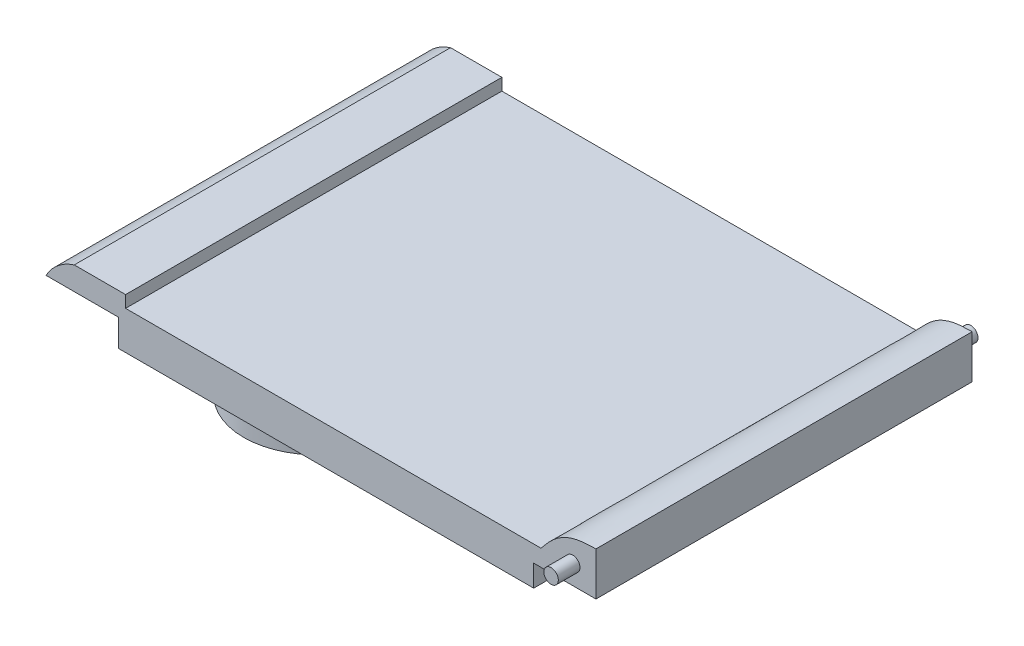
ISO-10303-21;
HEADER;
FILE_DESCRIPTION(('STEP AP214'),'2;1');
FILE_NAME('part.step','',(''),(''),'','','');
FILE_SCHEMA(('AUTOMOTIVE_DESIGN { 1 0 10303 214 1 1 1 1 }'));
ENDSEC;
DATA;
#1=APPLICATION_CONTEXT('core data for automotive mechanical design processes');
#2=APPLICATION_PROTOCOL_DEFINITION('international standard','automotive_design',2000,#1);
#3=PRODUCT_CONTEXT('',#1,'mechanical');
#4=PRODUCT('Part','Part','',(#3));
#5=PRODUCT_RELATED_PRODUCT_CATEGORY('part','',(#4));
#6=PRODUCT_DEFINITION_FORMATION('','',#4);
#7=PRODUCT_DEFINITION_CONTEXT('part definition',#1,'design');
#8=PRODUCT_DEFINITION('design','',#6,#7);
#9=PRODUCT_DEFINITION_SHAPE('','',#8);
#10=(LENGTH_UNIT() NAMED_UNIT(*) SI_UNIT(.MILLI.,.METRE.));
#11=(NAMED_UNIT(*) PLANE_ANGLE_UNIT() SI_UNIT($,.RADIAN.));
#12=(NAMED_UNIT(*) SI_UNIT($,.STERADIAN.) SOLID_ANGLE_UNIT());
#13=UNCERTAINTY_MEASURE_WITH_UNIT(LENGTH_MEASURE(1.E-05),#10,'distance_accuracy_value','');
#14=(GEOMETRIC_REPRESENTATION_CONTEXT(3) GLOBAL_UNCERTAINTY_ASSIGNED_CONTEXT((#13)) GLOBAL_UNIT_ASSIGNED_CONTEXT((#10,
#11,#12)) REPRESENTATION_CONTEXT('',''));
#15=CARTESIAN_POINT('',(0.,0.,0.));
#16=DIRECTION('',(0.,0.,1.));
#17=DIRECTION('',(1.,0.,0.));
#18=AXIS2_PLACEMENT_3D('',#15,#16,#17);
#19=CARTESIAN_POINT('',(-18.7826768324244,-0.738323827774544,26.));
#20=DIRECTION('',(0.,1.,0.));
#21=DIRECTION('',(0.,0.,1.));
#22=AXIS2_PLACEMENT_3D('',#19,#20,#21);
#23=PLANE('',#22);
#24=DIRECTION('',(1.,0.,0.));
#25=VECTOR('',#24,1.);
#26=CARTESIAN_POINT('',(-18.7826768324244,-0.738323827774544,0.));
#27=LINE('',#26,#25);
#28=CARTESIAN_POINT('',(-18.7826768324244,-0.738323827774544,0.));
#29=VERTEX_POINT('',#28);
#30=CARTESIAN_POINT('',(9.9173231675756,-0.738323827774544,0.));
#31=VERTEX_POINT('',#30);
#32=EDGE_CURVE('E177',#29,#31,#27,.T.);
#33=ORIENTED_EDGE('',*,*,#32,.T.);
#34=DIRECTION('',(0.,0.,-1.));
#35=VECTOR('',#34,1.);
#36=CARTESIAN_POINT('',(9.9173231675756,-0.738323827774544,26.));
#37=LINE('',#36,#35);
#38=CARTESIAN_POINT('',(9.9173231675756,-0.738323827774544,26.));
#39=VERTEX_POINT('',#38);
#40=EDGE_CURVE('E240',#39,#31,#37,.T.);
#41=ORIENTED_EDGE('',*,*,#40,.F.);
#42=DIRECTION('',(1.,0.,0.));
#43=VECTOR('',#42,1.);
#44=CARTESIAN_POINT('',(-18.7826768324244,-0.738323827774544,26.));
#45=LINE('',#44,#43);
#46=CARTESIAN_POINT('',(-18.7826768324244,-0.738323827774544,26.));
#47=VERTEX_POINT('',#46);
#48=EDGE_CURVE('E186',#47,#39,#45,.T.);
#49=ORIENTED_EDGE('',*,*,#48,.F.);
#50=DIRECTION('',(0.,0.,-1.));
#51=VECTOR('',#50,1.);
#52=CARTESIAN_POINT('',(-18.7826768324244,-0.738323827774544,26.));
#53=LINE('',#52,#51);
#54=EDGE_CURVE('E243',#47,#29,#53,.T.);
#55=ORIENTED_EDGE('',*,*,#54,.T.);
#56=EDGE_LOOP('',(#33,#41,#49,#55));
#57=FACE_BOUND('',#56,.T.);
#58=CARTESIAN_POINT('',(-13.1206768324244,-0.738323827774544,8.));
#59=DIRECTION('',(0.,-1.,0.));
#60=DIRECTION('',(0.,0.,-1.));
#61=AXIS2_PLACEMENT_3D('',#58,#59,#60);
#62=CIRCLE('',#61,5.00000000000001);
#63=CARTESIAN_POINT('',(-18.1206768324244,-0.738323827774544,8.));
#64=VERTEX_POINT('',#63);
#65=CARTESIAN_POINT('',(-8.1206768324244,-0.738323827774544,8.));
#66=VERTEX_POINT('',#65);
#67=EDGE_CURVE('E173',#64,#66,#62,.T.);
#68=ORIENTED_EDGE('',*,*,#67,.F.);
#69=DIRECTION('',(0.,0.,-1.));
#70=VECTOR('',#69,1.);
#71=CARTESIAN_POINT('',(-18.1206768324244,-0.738323827774544,8.));
#72=LINE('',#71,#70);
#73=CARTESIAN_POINT('',(-18.1206768324244,-0.738323827774544,18.));
#74=VERTEX_POINT('',#73);
#75=EDGE_CURVE('E170',#74,#64,#72,.T.);
#76=ORIENTED_EDGE('',*,*,#75,.F.);
#77=CARTESIAN_POINT('',(-13.1206768324244,-0.738323827774544,18.));
#78=DIRECTION('',(0.,-1.,0.));
#79=DIRECTION('',(0.,0.,-1.));
#80=AXIS2_PLACEMENT_3D('',#77,#78,#79);
#81=CIRCLE('',#80,5.00000000000001);
#82=CARTESIAN_POINT('',(-8.1206768324244,-0.738323827774544,18.));
#83=VERTEX_POINT('',#82);
#84=EDGE_CURVE('E66',#83,#74,#81,.T.);
#85=ORIENTED_EDGE('',*,*,#84,.F.);
#86=DIRECTION('',(0.,0.,1.));
#87=VECTOR('',#86,1.);
#88=CARTESIAN_POINT('',(-8.1206768324244,-0.738323827774544,8.));
#89=LINE('',#88,#87);
#90=EDGE_CURVE('E61',#66,#83,#89,.T.);
#91=ORIENTED_EDGE('',*,*,#90,.F.);
#92=EDGE_LOOP('',(#68,#76,#85,#91));
#93=FACE_BOUND('',#92,.T.);
#94=ADVANCED_FACE('F42',(#57,#93),#23,.F.);
#95=CARTESIAN_POINT('',(-18.7826768324244,1.13116617866198,26.));
#96=DIRECTION('',(1.,0.,0.));
#97=DIRECTION('',(0.,0.,-1.));
#98=AXIS2_PLACEMENT_3D('',#95,#96,#97);
#99=PLANE('',#98);
#100=DIRECTION('',(0.,-1.,0.));
#101=VECTOR('',#100,1.);
#102=CARTESIAN_POINT('',(-18.7826768324244,1.13116617866198,0.));
#103=LINE('',#102,#101);
#104=CARTESIAN_POINT('',(-18.7826768324244,1.13116617866198,0.));
#105=VERTEX_POINT('',#104);
#106=EDGE_CURVE('E174',#105,#29,#103,.T.);
#107=ORIENTED_EDGE('',*,*,#106,.T.);
#108=ORIENTED_EDGE('',*,*,#54,.F.);
#109=DIRECTION('',(0.,-1.,0.));
#110=VECTOR('',#109,1.);
#111=CARTESIAN_POINT('',(-18.7826768324244,1.13116617866198,26.));
#112=LINE('',#111,#110);
#113=CARTESIAN_POINT('',(-18.7826768324244,1.13116617866198,26.));
#114=VERTEX_POINT('',#113);
#115=EDGE_CURVE('E183',#114,#47,#112,.T.);
#116=ORIENTED_EDGE('',*,*,#115,.F.);
#117=DIRECTION('',(0.,0.,-1.));
#118=VECTOR('',#117,1.);
#119=CARTESIAN_POINT('',(-18.7826768324244,1.13116617866198,26.));
#120=LINE('',#119,#118);
#121=EDGE_CURVE('E202',#114,#105,#120,.T.);
#122=ORIENTED_EDGE('',*,*,#121,.T.);
#123=EDGE_LOOP('',(#107,#108,#116,#122));
#124=FACE_BOUND('',#123,.T.);
#125=ADVANCED_FACE('F394',(#124),#99,.F.);
#126=CARTESIAN_POINT('',(9.9173231675756,-0.738323827774544,26.));
#127=DIRECTION('',(-1.,0.,0.));
#128=DIRECTION('',(0.,0.,1.));
#129=AXIS2_PLACEMENT_3D('',#126,#127,#128);
#130=PLANE('',#129);
#131=DIRECTION('',(0.,1.,0.));
#132=VECTOR('',#131,1.);
#133=CARTESIAN_POINT('',(9.9173231675756,-0.738323827774544,0.));
#134=LINE('',#133,#132);
#135=CARTESIAN_POINT('',(9.9173231675756,0.761676172225456,0.));
#136=VERTEX_POINT('',#135);
#137=EDGE_CURVE('E205',#31,#136,#134,.T.);
#138=ORIENTED_EDGE('',*,*,#137,.T.);
#139=DIRECTION('',(0.,0.,-1.));
#140=VECTOR('',#139,1.);
#141=CARTESIAN_POINT('',(9.9173231675756,0.761676172225456,26.));
#142=LINE('',#141,#140);
#143=CARTESIAN_POINT('',(9.9173231675756,0.761676172225456,26.));
#144=VERTEX_POINT('',#143);
#145=EDGE_CURVE('E236',#144,#136,#142,.T.);
#146=ORIENTED_EDGE('',*,*,#145,.F.);
#147=DIRECTION('',(0.,1.,0.));
#148=VECTOR('',#147,1.);
#149=CARTESIAN_POINT('',(9.9173231675756,-0.738323827774544,26.));
#150=LINE('',#149,#148);
#151=EDGE_CURVE('E189',#39,#144,#150,.T.);
#152=ORIENTED_EDGE('',*,*,#151,.F.);
#153=ORIENTED_EDGE('',*,*,#40,.T.);
#154=EDGE_LOOP('',(#138,#146,#152,#153));
#155=FACE_BOUND('',#154,.T.);
#156=ADVANCED_FACE('F402',(#155),#130,.F.);
#157=CARTESIAN_POINT('',(9.9173231675756,0.761676172225456,26.));
#158=DIRECTION('',(0.,1.,0.));
#159=DIRECTION('',(-1.,0.,0.));
#160=AXIS2_PLACEMENT_3D('',#157,#158,#159);
#161=PLANE('',#160);
#162=DIRECTION('',(1.,0.,0.));
#163=VECTOR('',#162,1.);
#164=CARTESIAN_POINT('',(9.9173231675756,0.761676172225456,0.));
#165=LINE('',#164,#163);
#166=CARTESIAN_POINT('',(14.2173231675756,0.761676172225457,0.));
#167=VERTEX_POINT('',#166);
#168=EDGE_CURVE('E207',#136,#167,#165,.T.);
#169=ORIENTED_EDGE('',*,*,#168,.T.);
#170=DIRECTION('',(0.,0.,-1.));
#171=VECTOR('',#170,1.);
#172=CARTESIAN_POINT('',(14.2173231675756,0.761676172225457,26.));
#173=LINE('',#172,#171);
#174=CARTESIAN_POINT('',(14.2173231675756,0.761676172225457,26.));
#175=VERTEX_POINT('',#174);
#176=EDGE_CURVE('E233',#175,#167,#173,.T.);
#177=ORIENTED_EDGE('',*,*,#176,.F.);
#178=DIRECTION('',(1.,0.,0.));
#179=VECTOR('',#178,1.);
#180=CARTESIAN_POINT('',(9.9173231675756,0.761676172225456,26.));
#181=LINE('',#180,#179);
#182=EDGE_CURVE('E191',#144,#175,#181,.T.);
#183=ORIENTED_EDGE('',*,*,#182,.F.);
#184=ORIENTED_EDGE('',*,*,#145,.T.);
#185=EDGE_LOOP('',(#169,#177,#183,#184));
#186=FACE_BOUND('',#185,.T.);
#187=ADVANCED_FACE('F406',(#186),#161,.F.);
#188=CARTESIAN_POINT('',(14.2173231675756,0.761676172225457,26.));
#189=DIRECTION('',(-1.,0.,0.));
#190=DIRECTION('',(0.,0.,1.));
#191=AXIS2_PLACEMENT_3D('',#188,#189,#190);
#192=PLANE('',#191);
#193=DIRECTION('',(0.,1.,0.));
#194=VECTOR('',#193,1.);
#195=CARTESIAN_POINT('',(14.2173231675756,0.761676172225457,0.));
#196=LINE('',#195,#194);
#197=CARTESIAN_POINT('',(14.2173231675756,3.76167617222546,0.));
#198=VERTEX_POINT('',#197);
#199=EDGE_CURVE('E209',#167,#198,#196,.T.);
#200=ORIENTED_EDGE('',*,*,#199,.T.);
#201=CARTESIAN_POINT('',(14.2173231675756,3.76167617222545,27.3));
#202=CARTESIAN_POINT('',(14.2173231675756,3.76167617222545,17.7666666667059));
#203=CARTESIAN_POINT('',(14.2173231675756,3.76167617222545,8.23333333333334));
#204=CARTESIAN_POINT('',(14.2173231675756,3.76167617222545,-1.29999999999999));
#205=B_SPLINE_CURVE_WITH_KNOTS('',3,(#201,#202,#203,#204),.UNSPECIFIED.,.F.,.F.,(4,4),(-0.0013,
0.0273),.UNSPECIFIED.);
#206=CARTESIAN_POINT('',(14.2173231675756,3.76167617222546,26.));
#207=VERTEX_POINT('',#206);
#208=EDGE_CURVE('E237',#207,#198,#205,.T.);
#209=ORIENTED_EDGE('',*,*,#208,.F.);
#210=DIRECTION('',(0.,1.,0.));
#211=VECTOR('',#210,1.);
#212=CARTESIAN_POINT('',(14.2173231675756,0.761676172225457,26.));
#213=LINE('',#212,#211);
#214=EDGE_CURVE('E193',#175,#207,#213,.T.);
#215=ORIENTED_EDGE('',*,*,#214,.F.);
#216=ORIENTED_EDGE('',*,*,#176,.T.);
#217=EDGE_LOOP('',(#200,#209,#215,#216));
#218=FACE_BOUND('',#217,.T.);
#219=ADVANCED_FACE('F291',(#218),#192,.F.);
#220=CARTESIAN_POINT('',(10.4173231675756,1.90732009596442,26.));
#221=DIRECTION('',(0.,-1.,0.));
#222=DIRECTION('',(1.,0.,0.));
#223=AXIS2_PLACEMENT_3D('',#220,#221,#222);
#224=PLANE('',#223);
#225=DIRECTION('',(-1.,0.,0.));
#226=VECTOR('',#225,1.);
#227=CARTESIAN_POINT('',(10.4173231675756,1.90732009596442,0.));
#228=LINE('',#227,#226);
#229=CARTESIAN_POINT('',(10.4173231675756,1.90732009596442,0.));
#230=VERTEX_POINT('',#229);
#231=CARTESIAN_POINT('',(-18.2826768324244,1.90732009596441,0.));
#232=VERTEX_POINT('',#231);
#233=EDGE_CURVE('E213',#230,#232,#228,.T.);
#234=ORIENTED_EDGE('',*,*,#233,.T.);
#235=DIRECTION('',(0.,0.,-1.));
#236=VECTOR('',#235,1.);
#237=CARTESIAN_POINT('',(-18.2826768324244,1.90732009596441,26.));
#238=LINE('',#237,#236);
#239=CARTESIAN_POINT('',(-18.2826768324244,1.90732009596441,26.));
#240=VERTEX_POINT('',#239);
#241=EDGE_CURVE('E229',#240,#232,#238,.T.);
#242=ORIENTED_EDGE('',*,*,#241,.F.);
#243=DIRECTION('',(-1.,0.,0.));
#244=VECTOR('',#243,1.);
#245=CARTESIAN_POINT('',(10.4173231675756,1.90732009596442,26.));
#246=LINE('',#245,#244);
#247=CARTESIAN_POINT('',(10.4173231675756,1.90732009596442,26.));
#248=VERTEX_POINT('',#247);
#249=EDGE_CURVE('E197',#248,#240,#246,.T.);
#250=ORIENTED_EDGE('',*,*,#249,.F.);
#251=CARTESIAN_POINT('',(10.4173231675756,1.9073200959644,-1.29999999999999));
#252=CARTESIAN_POINT('',(10.4173231675756,1.9073200959644,8.23333333333334));
#253=CARTESIAN_POINT('',(10.4173231675756,1.9073200959644,17.7666666667059));
#254=CARTESIAN_POINT('',(10.4173231675756,1.9073200959644,27.3));
#255=B_SPLINE_CURVE_WITH_KNOTS('',3,(#251,#252,#253,#254),.UNSPECIFIED.,.F.,.F.,(4,4),(-0.0013,
0.0273),.UNSPECIFIED.);
#256=EDGE_CURVE('E232',#248,#230,#255,.F.);
#257=ORIENTED_EDGE('',*,*,#256,.T.);
#258=EDGE_LOOP('',(#234,#242,#250,#257));
#259=FACE_BOUND('',#258,.T.);
#260=ADVANCED_FACE('F286',(#259),#224,.F.);
#261=CARTESIAN_POINT('',(-18.2826768324244,1.90732009596441,26.));
#262=DIRECTION('',(-1.,0.,0.));
#263=DIRECTION('',(0.,-1.,0.));
#264=AXIS2_PLACEMENT_3D('',#261,#262,#263);
#265=PLANE('',#264);
#266=DIRECTION('',(0.,1.,0.));
#267=VECTOR('',#266,1.);
#268=CARTESIAN_POINT('',(-18.2826768324244,1.90732009596441,0.));
#269=LINE('',#268,#267);
#270=CARTESIAN_POINT('',(-18.2826768324244,2.73281296324977,0.));
#271=VERTEX_POINT('',#270);
#272=EDGE_CURVE('E210',#232,#271,#269,.T.);
#273=ORIENTED_EDGE('',*,*,#272,.T.);
#274=DIRECTION('',(0.,0.,-1.));
#275=VECTOR('',#274,1.);
#276=CARTESIAN_POINT('',(-18.2826768324244,2.73281296324977,26.));
#277=LINE('',#276,#275);
#278=CARTESIAN_POINT('',(-18.2826768324244,2.73281296324977,26.));
#279=VERTEX_POINT('',#278);
#280=EDGE_CURVE('E226',#279,#271,#277,.T.);
#281=ORIENTED_EDGE('',*,*,#280,.F.);
#282=DIRECTION('',(0.,1.,0.));
#283=VECTOR('',#282,1.);
#284=CARTESIAN_POINT('',(-18.2826768324244,1.90732009596441,26.));
#285=LINE('',#284,#283);
#286=EDGE_CURVE('E194',#240,#279,#285,.T.);
#287=ORIENTED_EDGE('',*,*,#286,.F.);
#288=ORIENTED_EDGE('',*,*,#241,.T.);
#289=EDGE_LOOP('',(#273,#281,#287,#288));
#290=FACE_BOUND('',#289,.T.);
#291=ADVANCED_FACE('F282',(#290),#265,.F.);
#292=CARTESIAN_POINT('',(-18.2826768324244,2.73281296324977,26.));
#293=DIRECTION('',(0.,-1.,0.));
#294=DIRECTION('',(1.,0.,0.));
#295=AXIS2_PLACEMENT_3D('',#292,#293,#294);
#296=PLANE('',#295);
#297=DIRECTION('',(-1.,0.,0.));
#298=VECTOR('',#297,1.);
#299=CARTESIAN_POINT('',(-18.2826768324244,2.73281296324977,0.));
#300=LINE('',#299,#298);
#301=CARTESIAN_POINT('',(-21.8299380739432,2.73281296324977,0.));
#302=VERTEX_POINT('',#301);
#303=EDGE_CURVE('E212',#271,#302,#300,.T.);
#304=ORIENTED_EDGE('',*,*,#303,.T.);
#305=DIRECTION('',(0.,0.,-1.));
#306=VECTOR('',#305,1.);
#307=CARTESIAN_POINT('',(-21.8299380739432,2.73281296324977,26.));
#308=LINE('',#307,#306);
#309=CARTESIAN_POINT('',(-21.8299380739432,2.73281296324977,26.));
#310=VERTEX_POINT('',#309);
#311=EDGE_CURVE('E223',#310,#302,#308,.T.);
#312=ORIENTED_EDGE('',*,*,#311,.F.);
#313=DIRECTION('',(-1.,0.,0.));
#314=VECTOR('',#313,1.);
#315=CARTESIAN_POINT('',(-18.2826768324244,2.73281296324977,26.));
#316=LINE('',#315,#314);
#317=EDGE_CURVE('E196',#279,#310,#316,.T.);
#318=ORIENTED_EDGE('',*,*,#317,.F.);
#319=ORIENTED_EDGE('',*,*,#280,.T.);
#320=EDGE_LOOP('',(#304,#312,#318,#319));
#321=FACE_BOUND('',#320,.T.);
#322=ADVANCED_FACE('F278',(#321),#296,.F.);
#323=CARTESIAN_POINT('',(-20.821754172857,-0.487591416597912,26.));
#324=DIRECTION('',(0.,0.,-1.));
#325=DIRECTION('',(-1.,0.,0.));
#326=AXIS2_PLACEMENT_3D('',#323,#324,#325);
#327=CYLINDRICAL_SURFACE('',#326,3.3745279889418);
#328=CARTESIAN_POINT('',(-20.821754172857,-0.487591416597912,0.));
#329=DIRECTION('',(0.,0.,1.));
#330=DIRECTION('',(-1.,0.,0.));
#331=AXIS2_PLACEMENT_3D('',#328,#329,#330);
#332=CIRCLE('',#331,3.3745279889418);
#333=CARTESIAN_POINT('',(-23.7826768324244,1.13116617866198,0.));
#334=VERTEX_POINT('',#333);
#335=EDGE_CURVE('E215',#302,#334,#332,.T.);
#336=ORIENTED_EDGE('',*,*,#335,.T.);
#337=DIRECTION('',(0.,0.,-1.));
#338=VECTOR('',#337,1.);
#339=CARTESIAN_POINT('',(-23.7826768324244,1.13116617866198,26.));
#340=LINE('',#339,#338);
#341=CARTESIAN_POINT('',(-23.7826768324244,1.13116617866198,26.));
#342=VERTEX_POINT('',#341);
#343=EDGE_CURVE('E220',#342,#334,#340,.T.);
#344=ORIENTED_EDGE('',*,*,#343,.F.);
#345=CARTESIAN_POINT('',(-20.821754172857,-0.487591416597912,26.));
#346=DIRECTION('',(0.,0.,1.));
#347=DIRECTION('',(-1.,0.,0.));
#348=AXIS2_PLACEMENT_3D('',#345,#346,#347);
#349=CIRCLE('',#348,3.3745279889418);
#350=EDGE_CURVE('E199',#310,#342,#349,.T.);
#351=ORIENTED_EDGE('',*,*,#350,.F.);
#352=ORIENTED_EDGE('',*,*,#311,.T.);
#353=EDGE_LOOP('',(#336,#344,#351,#352));
#354=FACE_BOUND('',#353,.T.);
#355=ADVANCED_FACE('F274',(#354),#327,.T.);
#356=CARTESIAN_POINT('',(-23.7826768324244,1.13116617866198,26.));
#357=DIRECTION('',(0.,1.,0.));
#358=DIRECTION('',(0.,0.,1.));
#359=AXIS2_PLACEMENT_3D('',#356,#357,#358);
#360=PLANE('',#359);
#361=DIRECTION('',(1.,0.,0.));
#362=VECTOR('',#361,1.);
#363=CARTESIAN_POINT('',(-23.7826768324244,1.13116617866198,0.));
#364=LINE('',#363,#362);
#365=EDGE_CURVE('E187',#334,#105,#364,.T.);
#366=ORIENTED_EDGE('',*,*,#365,.T.);
#367=ORIENTED_EDGE('',*,*,#121,.F.);
#368=DIRECTION('',(1.,0.,0.));
#369=VECTOR('',#368,1.);
#370=CARTESIAN_POINT('',(-23.7826768324244,1.13116617866198,26.));
#371=LINE('',#370,#369);
#372=EDGE_CURVE('E201',#342,#114,#371,.T.);
#373=ORIENTED_EDGE('',*,*,#372,.F.);
#374=ORIENTED_EDGE('',*,*,#343,.T.);
#375=EDGE_LOOP('',(#366,#367,#373,#374));
#376=FACE_BOUND('',#375,.T.);
#377=ADVANCED_FACE('F271',(#376),#360,.F.);
#378=CARTESIAN_POINT('',(-20.821754172857,-0.487591416597912,26.));
#379=DIRECTION('',(0.,0.,-1.));
#380=DIRECTION('',(-1.,0.,0.));
#381=AXIS2_PLACEMENT_3D('',#378,#379,#380);
#382=PLANE('',#381);
#383=CARTESIAN_POINT('',(12.6173231675756,2.09167617222546,26.));
#384=DIRECTION('',(0.,0.,-1.));
#385=DIRECTION('',(-1.,0.,0.));
#386=AXIS2_PLACEMENT_3D('',#383,#384,#385);
#387=CIRCLE('',#386,0.499999999999999);
#388=CARTESIAN_POINT('',(12.1173231675756,2.09167617222546,26.));
#389=VERTEX_POINT('',#388);
#390=EDGE_CURVE('E11',#389,#389,#387,.F.);
#391=ORIENTED_EDGE('',*,*,#390,.F.);
#392=EDGE_LOOP('',(#391));
#393=FACE_BOUND('',#392,.T.);
#394=ORIENTED_EDGE('',*,*,#214,.T.);
#395=CARTESIAN_POINT('',(10.4173231675756,1.9073200959644,26.0000000000066));
#396=CARTESIAN_POINT('',(10.6843352214785,2.23735055388623,26.0000000000066));
#397=CARTESIAN_POINT('',(10.9513472753814,2.56738101180805,26.0000000000066));
#398=CARTESIAN_POINT('',(11.6170888547048,3.24733371747333,25.9999999999901));
#399=CARTESIAN_POINT('',(12.4227784428697,3.64050092362964,25.9999999999901));
#400=CARTESIAN_POINT('',(13.3684160398763,3.74688263027699,26.0000000000066));
#401=CARTESIAN_POINT('',(13.7928696037259,3.75427940125122,26.0000000000066));
#402=CARTESIAN_POINT('',(14.2173231675756,3.76167617222545,26.0000000000066));
#403=B_SPLINE_CURVE_WITH_KNOTS('',5,(#395,#396,#397,#398,#399,#400,#401,#402),.UNSPECIFIED.,.F.,
.F.,(6,2,6),(0.,0.5,1.),.UNSPECIFIED.);
#404=EDGE_CURVE('E54',#207,#248,#403,.F.);
#405=ORIENTED_EDGE('',*,*,#404,.T.);
#406=ORIENTED_EDGE('',*,*,#249,.T.);
#407=ORIENTED_EDGE('',*,*,#286,.T.);
#408=ORIENTED_EDGE('',*,*,#317,.T.);
#409=ORIENTED_EDGE('',*,*,#350,.T.);
#410=ORIENTED_EDGE('',*,*,#372,.T.);
#411=ORIENTED_EDGE('',*,*,#115,.T.);
#412=ORIENTED_EDGE('',*,*,#48,.T.);
#413=ORIENTED_EDGE('',*,*,#151,.T.);
#414=ORIENTED_EDGE('',*,*,#182,.T.);
#415=EDGE_LOOP('',(#394,#405,#406,#407,#408,#409,#410,#411,#412,#413,#414));
#416=FACE_BOUND('',#415,.T.);
#417=ADVANCED_FACE('F267',(#393,#416),#382,.F.);
#418=CARTESIAN_POINT('',(-20.821754172857,-0.487591416597912,0.));
#419=DIRECTION('',(0.,0.,-1.));
#420=DIRECTION('',(-1.,0.,0.));
#421=AXIS2_PLACEMENT_3D('',#418,#419,#420);
#422=PLANE('',#421);
#423=CARTESIAN_POINT('',(12.6173231675756,2.09167617222546,0.));
#424=DIRECTION('',(0.,0.,1.));
#425=DIRECTION('',(1.,0.,0.));
#426=AXIS2_PLACEMENT_3D('',#423,#424,#425);
#427=CIRCLE('',#426,0.499999999999999);
#428=CARTESIAN_POINT('',(13.1173231675756,2.09167617222546,0.));
#429=VERTEX_POINT('',#428);
#430=EDGE_CURVE('E670',#429,#429,#427,.T.);
#431=ORIENTED_EDGE('',*,*,#430,.T.);
#432=EDGE_LOOP('',(#431));
#433=FACE_BOUND('',#432,.T.);
#434=ORIENTED_EDGE('',*,*,#233,.F.);
#435=CARTESIAN_POINT('',(14.2173231675756,3.76167617222545,3.1192496502408E-13));
#436=CARTESIAN_POINT('',(13.7928696037259,3.75427940125122,3.12141805458577E-13));
#437=CARTESIAN_POINT('',(13.3684160398763,3.74688263027699,3.12358645893074E-13));
#438=CARTESIAN_POINT('',(12.4227784428697,3.64050092362964,-4.69839011446593E-13));
#439=CARTESIAN_POINT('',(11.6170888547048,3.24733371747333,-4.69839011446593E-13));
#440=CARTESIAN_POINT('',(10.9513472753814,2.56738101180805,3.12358645893074E-13));
#441=CARTESIAN_POINT('',(10.6843352214785,2.23735055388623,3.12141805458577E-13));
#442=CARTESIAN_POINT('',(10.4173231675756,1.9073200959644,3.1192496502408E-13));
#443=B_SPLINE_CURVE_WITH_KNOTS('',5,(#435,#436,#437,#438,#439,#440,#441,#442),.UNSPECIFIED.,.F.,
.F.,(6,2,6),(0.,0.5,1.),.UNSPECIFIED.);
#444=EDGE_CURVE('E246',#230,#198,#443,.F.);
#445=ORIENTED_EDGE('',*,*,#444,.T.);
#446=ORIENTED_EDGE('',*,*,#199,.F.);
#447=ORIENTED_EDGE('',*,*,#168,.F.);
#448=ORIENTED_EDGE('',*,*,#137,.F.);
#449=ORIENTED_EDGE('',*,*,#32,.F.);
#450=ORIENTED_EDGE('',*,*,#106,.F.);
#451=ORIENTED_EDGE('',*,*,#365,.F.);
#452=ORIENTED_EDGE('',*,*,#335,.F.);
#453=ORIENTED_EDGE('',*,*,#303,.F.);
#454=ORIENTED_EDGE('',*,*,#272,.F.);
#455=EDGE_LOOP('',(#434,#445,#446,#447,#448,#449,#450,#451,#452,#453,#454));
#456=FACE_BOUND('',#455,.T.);
#457=ADVANCED_FACE('F257',(#433,#456),#422,.T.);
#458=CARTESIAN_POINT('',(10.4173231675756,1.9073200959644,27.3));
#459=CARTESIAN_POINT('',(10.4173231675756,1.9073200959644,17.7666666667059));
#460=CARTESIAN_POINT('',(10.4173231675756,1.9073200959644,8.23333333333334));
#461=CARTESIAN_POINT('',(10.4173231675756,1.9073200959644,-1.29999999999999));
#462=CARTESIAN_POINT('',(10.6843352214785,2.23735055388623,27.3));
#463=CARTESIAN_POINT('',(10.6843352214785,2.23735055388623,17.7666666667059));
#464=CARTESIAN_POINT('',(10.6843352214785,2.23735055388623,8.23333333333334));
#465=CARTESIAN_POINT('',(10.6843352214785,2.23735055388623,-1.29999999999999));
#466=CARTESIAN_POINT('',(10.9513472753814,2.56738101180805,27.3));
#467=CARTESIAN_POINT('',(10.9513472753814,2.56738101180805,17.7666666667059));
#468=CARTESIAN_POINT('',(10.9513472753814,2.56738101180805,8.23333333333334));
#469=CARTESIAN_POINT('',(10.9513472753814,2.56738101180805,-1.29999999999999));
#470=CARTESIAN_POINT('',(11.6170888547048,3.24733371747333,27.3));
#471=CARTESIAN_POINT('',(11.6170888547048,3.24733371747333,17.7666666665736));
#472=CARTESIAN_POINT('',(11.6170888547048,3.24733371747333,8.23333333333334));
#473=CARTESIAN_POINT('',(11.6170888547048,3.24733371747333,-1.29999999999999));
#474=CARTESIAN_POINT('',(12.4227784428697,3.64050092362964,27.3));
#475=CARTESIAN_POINT('',(12.4227784428697,3.64050092362965,17.7666666665736));
#476=CARTESIAN_POINT('',(12.4227784428697,3.64050092362964,8.23333333333334));
#477=CARTESIAN_POINT('',(12.4227784428697,3.64050092362964,-1.29999999999999));
#478=CARTESIAN_POINT('',(13.3684160398763,3.74688263027699,27.3));
#479=CARTESIAN_POINT('',(13.3684160398763,3.74688263027699,17.7666666667059));
#480=CARTESIAN_POINT('',(13.3684160398763,3.74688263027699,8.23333333333334));
#481=CARTESIAN_POINT('',(13.3684160398763,3.74688263027699,-1.29999999999999));
#482=CARTESIAN_POINT('',(13.7928696037259,3.75427940125122,27.3));
#483=CARTESIAN_POINT('',(13.7928696037259,3.75427940125122,17.7666666667059));
#484=CARTESIAN_POINT('',(13.7928696037259,3.75427940125122,8.23333333333334));
#485=CARTESIAN_POINT('',(13.7928696037259,3.75427940125122,-1.29999999999999));
#486=CARTESIAN_POINT('',(14.2173231675756,3.76167617222545,27.3));
#487=CARTESIAN_POINT('',(14.2173231675756,3.76167617222545,17.7666666667059));
#488=CARTESIAN_POINT('',(14.2173231675756,3.76167617222545,8.23333333333334));
#489=CARTESIAN_POINT('',(14.2173231675756,3.76167617222545,-1.29999999999999));
#490=B_SPLINE_SURFACE_WITH_KNOTS('',5,3,((#458,#459,#460,#461),(#462,#463,#464,#465),(#466,#467,
#468,#469),(#470,#471,#472,#473),(#474,#475,#476,#477),(#478,#479,#480,#481),(#482,#483,#484,
#485),(#486,#487,#488,#489)),.UNSPECIFIED.,.F.,.F.,.F.,(6,2,6),(4,4),(0.,0.5,1.),(-0.0013,
0.0273),.UNSPECIFIED.);
#491=ORIENTED_EDGE('',*,*,#404,.F.);
#492=ORIENTED_EDGE('',*,*,#208,.T.);
#493=ORIENTED_EDGE('',*,*,#444,.F.);
#494=ORIENTED_EDGE('',*,*,#256,.F.);
#495=EDGE_LOOP('',(#491,#492,#493,#494));
#496=FACE_BOUND('',#495,.T.);
#497=ADVANCED_FACE('F45',(#496),#490,.T.);
#498=CARTESIAN_POINT('',(-13.1206768324244,-4.73832382777454,8.));
#499=DIRECTION('',(0.,1.,0.));
#500=DIRECTION('',(0.,0.,1.));
#501=AXIS2_PLACEMENT_3D('',#498,#499,#500);
#502=CYLINDRICAL_SURFACE('',#501,5.00000000000001);
#503=ORIENTED_EDGE('',*,*,#67,.T.);
#504=DIRECTION('',(0.,1.,0.));
#505=VECTOR('',#504,1.);
#506=CARTESIAN_POINT('',(-8.1206768324244,-4.73832382777454,8.));
#507=LINE('',#506,#505);
#508=CARTESIAN_POINT('',(-8.1206768324244,-4.73832382777454,8.));
#509=VERTEX_POINT('',#508);
#510=EDGE_CURVE('E154',#509,#66,#507,.T.);
#511=ORIENTED_EDGE('',*,*,#510,.F.);
#512=CARTESIAN_POINT('',(-13.1206768324244,-4.73832382777454,8.));
#513=DIRECTION('',(0.,-1.,0.));
#514=DIRECTION('',(0.,0.,-1.));
#515=AXIS2_PLACEMENT_3D('',#512,#513,#514);
#516=CIRCLE('',#515,5.00000000000001);
#517=CARTESIAN_POINT('',(-18.1206768324244,-4.73832382777454,8.));
#518=VERTEX_POINT('',#517);
#519=EDGE_CURVE('E161',#518,#509,#516,.T.);
#520=ORIENTED_EDGE('',*,*,#519,.F.);
#521=DIRECTION('',(0.,1.,0.));
#522=VECTOR('',#521,1.);
#523=CARTESIAN_POINT('',(-18.1206768324244,-4.73832382777454,8.));
#524=LINE('',#523,#522);
#525=EDGE_CURVE('E680',#518,#64,#524,.T.);
#526=ORIENTED_EDGE('',*,*,#525,.T.);
#527=EDGE_LOOP('',(#503,#511,#520,#526));
#528=FACE_BOUND('',#527,.T.);
#529=ADVANCED_FACE('F172',(#528),#502,.T.);
#530=CARTESIAN_POINT('',(-8.1206768324244,-4.73832382777454,8.));
#531=DIRECTION('',(-1.,0.,0.));
#532=DIRECTION('',(0.,0.,1.));
#533=AXIS2_PLACEMENT_3D('',#530,#531,#532);
#534=PLANE('',#533);
#535=ORIENTED_EDGE('',*,*,#90,.T.);
#536=DIRECTION('',(0.,1.,0.));
#537=VECTOR('',#536,1.);
#538=CARTESIAN_POINT('',(-8.1206768324244,-4.73832382777454,18.));
#539=LINE('',#538,#537);
#540=CARTESIAN_POINT('',(-8.1206768324244,-4.73832382777454,18.));
#541=VERTEX_POINT('',#540);
#542=EDGE_CURVE('E157',#541,#83,#539,.T.);
#543=ORIENTED_EDGE('',*,*,#542,.F.);
#544=DIRECTION('',(0.,0.,1.));
#545=VECTOR('',#544,1.);
#546=CARTESIAN_POINT('',(-8.1206768324244,-4.73832382777454,8.));
#547=LINE('',#546,#545);
#548=EDGE_CURVE('E150',#509,#541,#547,.T.);
#549=ORIENTED_EDGE('',*,*,#548,.F.);
#550=ORIENTED_EDGE('',*,*,#510,.T.);
#551=EDGE_LOOP('',(#535,#543,#549,#550));
#552=FACE_BOUND('',#551,.T.);
#553=ADVANCED_FACE('F152',(#552),#534,.F.);
#554=CARTESIAN_POINT('',(-13.1206768324244,-4.73832382777454,18.));
#555=DIRECTION('',(0.,1.,0.));
#556=DIRECTION('',(0.,0.,1.));
#557=AXIS2_PLACEMENT_3D('',#554,#555,#556);
#558=CYLINDRICAL_SURFACE('',#557,5.00000000000001);
#559=ORIENTED_EDGE('',*,*,#84,.T.);
#560=DIRECTION('',(0.,1.,0.));
#561=VECTOR('',#560,1.);
#562=CARTESIAN_POINT('',(-18.1206768324244,-4.73832382777454,18.));
#563=LINE('',#562,#561);
#564=CARTESIAN_POINT('',(-18.1206768324244,-4.73832382777454,18.));
#565=VERTEX_POINT('',#564);
#566=EDGE_CURVE('E179',#565,#74,#563,.T.);
#567=ORIENTED_EDGE('',*,*,#566,.F.);
#568=CARTESIAN_POINT('',(-13.1206768324244,-4.73832382777454,18.));
#569=DIRECTION('',(0.,-1.,0.));
#570=DIRECTION('',(0.,0.,-1.));
#571=AXIS2_PLACEMENT_3D('',#568,#569,#570);
#572=CIRCLE('',#571,5.00000000000001);
#573=EDGE_CURVE('E160',#541,#565,#572,.T.);
#574=ORIENTED_EDGE('',*,*,#573,.F.);
#575=ORIENTED_EDGE('',*,*,#542,.T.);
#576=EDGE_LOOP('',(#559,#567,#574,#575));
#577=FACE_BOUND('',#576,.T.);
#578=ADVANCED_FACE('F502',(#577),#558,.T.);
#579=CARTESIAN_POINT('',(-18.1206768324244,-4.73832382777454,8.));
#580=DIRECTION('',(1.,0.,0.));
#581=DIRECTION('',(0.,0.,-1.));
#582=AXIS2_PLACEMENT_3D('',#579,#580,#581);
#583=PLANE('',#582);
#584=ORIENTED_EDGE('',*,*,#75,.T.);
#585=ORIENTED_EDGE('',*,*,#525,.F.);
#586=DIRECTION('',(0.,0.,-1.));
#587=VECTOR('',#586,1.);
#588=CARTESIAN_POINT('',(-18.1206768324244,-4.73832382777454,8.));
#589=LINE('',#588,#587);
#590=EDGE_CURVE('E166',#565,#518,#589,.T.);
#591=ORIENTED_EDGE('',*,*,#590,.F.);
#592=ORIENTED_EDGE('',*,*,#566,.T.);
#593=EDGE_LOOP('',(#584,#585,#591,#592));
#594=FACE_BOUND('',#593,.T.);
#595=ADVANCED_FACE('F511',(#594),#583,.F.);
#596=CARTESIAN_POINT('',(-13.1206768324244,-4.73832382777454,8.));
#597=DIRECTION('',(0.,-1.,0.));
#598=DIRECTION('',(0.,0.,-1.));
#599=AXIS2_PLACEMENT_3D('',#596,#597,#598);
#600=PLANE('',#599);
#601=ORIENTED_EDGE('',*,*,#519,.T.);
#602=ORIENTED_EDGE('',*,*,#548,.T.);
#603=ORIENTED_EDGE('',*,*,#573,.T.);
#604=ORIENTED_EDGE('',*,*,#590,.T.);
#605=EDGE_LOOP('',(#601,#602,#603,#604));
#606=FACE_BOUND('',#605,.T.);
#607=ADVANCED_FACE('F164',(#606),#600,.T.);
#608=CARTESIAN_POINT('',(12.6173231675756,2.09167617222546,27.5));
#609=DIRECTION('',(0.,0.,-1.));
#610=DIRECTION('',(-1.,0.,0.));
#611=AXIS2_PLACEMENT_3D('',#608,#609,#610);
#612=CYLINDRICAL_SURFACE('',#611,0.499999999999999);
#613=CARTESIAN_POINT('',(12.6173231675756,2.09167617222546,27.5));
#614=DIRECTION('',(0.,0.,1.));
#615=DIRECTION('',(1.,0.,0.));
#616=AXIS2_PLACEMENT_3D('',#613,#614,#615);
#617=CIRCLE('',#616,0.499999999999999);
#618=CARTESIAN_POINT('',(13.1173231675756,2.09167617222546,27.5));
#619=VERTEX_POINT('',#618);
#620=EDGE_CURVE('E673',#619,#619,#617,.T.);
#621=ORIENTED_EDGE('',*,*,#620,.F.);
#622=EDGE_LOOP('',(#621));
#623=FACE_BOUND('',#622,.T.);
#624=ORIENTED_EDGE('',*,*,#390,.T.);
#625=EDGE_LOOP('',(#624));
#626=FACE_BOUND('',#625,.T.);
#627=ADVANCED_FACE('F529',(#623,#626),#612,.T.);
#628=CARTESIAN_POINT('',(12.6173231675756,2.09167617222546,27.5));
#629=DIRECTION('',(0.,0.,1.));
#630=DIRECTION('',(1.,0.,0.));
#631=AXIS2_PLACEMENT_3D('',#628,#629,#630);
#632=PLANE('',#631);
#633=ORIENTED_EDGE('',*,*,#620,.T.);
#634=EDGE_LOOP('',(#633));
#635=FACE_BOUND('',#634,.T.);
#636=ADVANCED_FACE('F537',(#635),#632,.T.);
#637=CARTESIAN_POINT('',(12.6173231675756,2.09167617222546,0.));
#638=DIRECTION('',(0.,0.,-1.));
#639=DIRECTION('',(-1.,0.,0.));
#640=AXIS2_PLACEMENT_3D('',#637,#638,#639);
#641=CYLINDRICAL_SURFACE('',#640,0.499999999999999);
#642=ORIENTED_EDGE('',*,*,#430,.F.);
#643=EDGE_LOOP('',(#642));
#644=FACE_BOUND('',#643,.T.);
#645=CARTESIAN_POINT('',(12.6173231675756,2.09167617222546,-1.5));
#646=DIRECTION('',(0.,0.,1.));
#647=DIRECTION('',(1.,0.,0.));
#648=AXIS2_PLACEMENT_3D('',#645,#646,#647);
#649=CIRCLE('',#648,0.499999999999999);
#650=CARTESIAN_POINT('',(13.1173231675756,2.09167617222546,-1.5));
#651=VERTEX_POINT('',#650);
#652=EDGE_CURVE('E668',#651,#651,#649,.T.);
#653=ORIENTED_EDGE('',*,*,#652,.T.);
#654=EDGE_LOOP('',(#653));
#655=FACE_BOUND('',#654,.T.);
#656=ADVANCED_FACE('F546',(#644,#655),#641,.T.);
#657=CARTESIAN_POINT('',(12.6173231675756,2.09167617222546,-1.5));
#658=DIRECTION('',(0.,0.,1.));
#659=DIRECTION('',(1.,0.,0.));
#660=AXIS2_PLACEMENT_3D('',#657,#658,#659);
#661=PLANE('',#660);
#662=ORIENTED_EDGE('',*,*,#652,.F.);
#663=EDGE_LOOP('',(#662));
#664=FACE_BOUND('',#663,.T.);
#665=ADVANCED_FACE('F555',(#664),#661,.F.);
#666=CLOSED_SHELL('',(#94,#125,#156,#187,#219,#260,#291,#322,#355,#377,#417,#457,#497,#529,#553,
#578,#595,#607,#627,#636,#656,#665));
#667=MANIFOLD_SOLID_BREP('B2',#666);
#668=ADVANCED_BREP_SHAPE_REPRESENTATION('',(#18,#667),#14);
#669=SHAPE_DEFINITION_REPRESENTATION(#9,#668);
ENDSEC;
END-ISO-10303-21;
